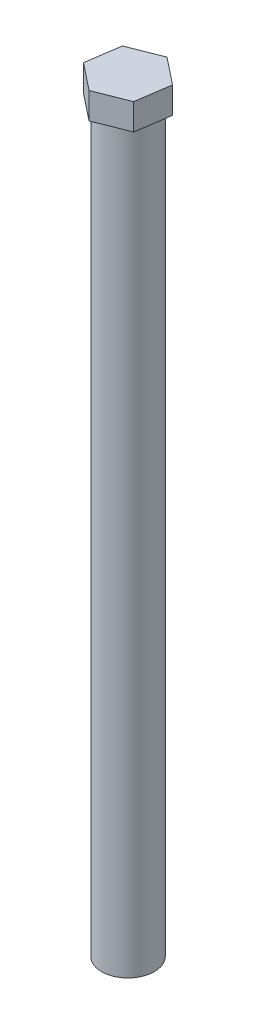
ISO-10303-21;
HEADER;
FILE_DESCRIPTION(('STEP AP214'),'2;1');
FILE_NAME('part.step','',(''),(''),'','','');
FILE_SCHEMA(('AUTOMOTIVE_DESIGN { 1 0 10303 214 1 1 1 1 }'));
ENDSEC;
DATA;
#1=APPLICATION_CONTEXT('core data for automotive mechanical design processes');
#2=APPLICATION_PROTOCOL_DEFINITION('international standard','automotive_design',2000,#1);
#3=PRODUCT_CONTEXT('',#1,'mechanical');
#4=PRODUCT('Part','Part','',(#3));
#5=PRODUCT_RELATED_PRODUCT_CATEGORY('part','',(#4));
#6=PRODUCT_DEFINITION_FORMATION('','',#4);
#7=PRODUCT_DEFINITION_CONTEXT('part definition',#1,'design');
#8=PRODUCT_DEFINITION('design','',#6,#7);
#9=PRODUCT_DEFINITION_SHAPE('','',#8);
#10=(LENGTH_UNIT() NAMED_UNIT(*) SI_UNIT(.MILLI.,.METRE.));
#11=(NAMED_UNIT(*) PLANE_ANGLE_UNIT() SI_UNIT($,.RADIAN.));
#12=(NAMED_UNIT(*) SI_UNIT($,.STERADIAN.) SOLID_ANGLE_UNIT());
#13=UNCERTAINTY_MEASURE_WITH_UNIT(LENGTH_MEASURE(1.E-05),#10,'distance_accuracy_value','');
#14=(GEOMETRIC_REPRESENTATION_CONTEXT(3) GLOBAL_UNCERTAINTY_ASSIGNED_CONTEXT((#13)) GLOBAL_UNIT_ASSIGNED_CONTEXT((#10,
#11,#12)) REPRESENTATION_CONTEXT('',''));
#15=CARTESIAN_POINT('',(0.,0.,0.));
#16=DIRECTION('',(0.,0.,1.));
#17=DIRECTION('',(1.,0.,0.));
#18=AXIS2_PLACEMENT_3D('',#15,#16,#17);
#19=CARTESIAN_POINT('',(0.,56.,0.));
#20=DIRECTION('',(0.,-1.,0.));
#21=DIRECTION('',(0.,0.,-1.));
#22=AXIS2_PLACEMENT_3D('',#19,#20,#21);
#23=CYLINDRICAL_SURFACE('',#22,2.);
#24=CARTESIAN_POINT('',(0.,56.,0.));
#25=DIRECTION('',(0.,1.,0.));
#26=DIRECTION('',(0.,0.,1.));
#27=AXIS2_PLACEMENT_3D('',#24,#25,#26);
#28=CIRCLE('',#27,2.);
#29=CARTESIAN_POINT('',(0.,56.,2.));
#30=VERTEX_POINT('',#29);
#31=EDGE_CURVE('E11',#30,#30,#28,.T.);
#32=ORIENTED_EDGE('',*,*,#31,.F.);
#33=EDGE_LOOP('',(#32));
#34=FACE_BOUND('',#33,.T.);
#35=CARTESIAN_POINT('',(0.,0.,0.));
#36=DIRECTION('',(0.,1.,0.));
#37=DIRECTION('',(0.,0.,1.));
#38=AXIS2_PLACEMENT_3D('',#35,#36,#37);
#39=CIRCLE('',#38,2.);
#40=CARTESIAN_POINT('',(0.,0.,2.));
#41=VERTEX_POINT('',#40);
#42=EDGE_CURVE('E41',#41,#41,#39,.T.);
#43=ORIENTED_EDGE('',*,*,#42,.T.);
#44=EDGE_LOOP('',(#43));
#45=FACE_BOUND('',#44,.T.);
#46=ADVANCED_FACE('F38',(#34,#45),#23,.T.);
#47=CARTESIAN_POINT('',(0.,0.,0.));
#48=DIRECTION('',(0.,1.,0.));
#49=DIRECTION('',(0.,0.,1.));
#50=AXIS2_PLACEMENT_3D('',#47,#48,#49);
#51=PLANE('',#50);
#52=ORIENTED_EDGE('',*,*,#42,.F.);
#53=EDGE_LOOP('',(#52));
#54=FACE_BOUND('',#53,.T.);
#55=ADVANCED_FACE('F146',(#54),#51,.F.);
#56=CARTESIAN_POINT('',(-0.379215264473462,58.,2.57451992844357));
#57=DIRECTION('',(-0.368462703379493,0.,-0.929642531416391));
#58=DIRECTION('',(-0.929642531416391,0.,0.368462703379493));
#59=AXIS2_PLACEMENT_3D('',#56,#57,#58);
#60=PLANE('',#59);
#61=DIRECTION('',(0.929642531416391,0.,-0.368462703379493));
#62=VECTOR('',#61,1.);
#63=CARTESIAN_POINT('',(-0.379215264473462,56.,2.57451992844357));
#64=LINE('',#63,#62);
#65=CARTESIAN_POINT('',(-0.379215264473462,56.,2.57451992844357));
#66=VERTEX_POINT('',#65);
#67=CARTESIAN_POINT('',(2.0399920283447,56.,1.61567001675864));
#68=VERTEX_POINT('',#67);
#69=EDGE_CURVE('E123',#66,#68,#64,.T.);
#70=ORIENTED_EDGE('',*,*,#69,.T.);
#71=DIRECTION('',(0.,-1.,0.));
#72=VECTOR('',#71,1.);
#73=CARTESIAN_POINT('',(2.0399920283447,58.,1.61567001675864));
#74=LINE('',#73,#72);
#75=CARTESIAN_POINT('',(2.0399920283447,58.,1.61567001675864));
#76=VERTEX_POINT('',#75);
#77=EDGE_CURVE('E140',#76,#68,#74,.T.);
#78=ORIENTED_EDGE('',*,*,#77,.F.);
#79=DIRECTION('',(0.929642531416391,0.,-0.368462703379493));
#80=VECTOR('',#79,1.);
#81=CARTESIAN_POINT('',(-0.379215264473462,58.,2.57451992844357));
#82=LINE('',#81,#80);
#83=CARTESIAN_POINT('',(-0.379215264473462,58.,2.57451992844357));
#84=VERTEX_POINT('',#83);
#85=EDGE_CURVE('E133',#84,#76,#82,.T.);
#86=ORIENTED_EDGE('',*,*,#85,.F.);
#87=DIRECTION('',(0.,-1.,0.));
#88=VECTOR('',#87,1.);
#89=CARTESIAN_POINT('',(-0.379215264473462,58.,2.57451992844357));
#90=LINE('',#89,#88);
#91=EDGE_CURVE('E119',#84,#66,#90,.T.);
#92=ORIENTED_EDGE('',*,*,#91,.T.);
#93=EDGE_LOOP('',(#70,#78,#86,#92));
#94=FACE_BOUND('',#93,.T.);
#95=ADVANCED_FACE('F148',(#94),#60,.F.);
#96=CARTESIAN_POINT('',(2.0399920283447,58.,1.61567001675864));
#97=DIRECTION('',(-0.989325400334814,0.,-0.145723204234464));
#98=DIRECTION('',(-0.145723204234464,0.,0.989325400334814));
#99=AXIS2_PLACEMENT_3D('',#96,#97,#98);
#100=PLANE('',#99);
#101=DIRECTION('',(0.145723204234464,0.,-0.989325400334814));
#102=VECTOR('',#101,1.);
#103=CARTESIAN_POINT('',(2.0399920283447,56.,1.61567001675864));
#104=LINE('',#103,#102);
#105=CARTESIAN_POINT('',(2.41920729281816,56.,-0.958849911684933));
#106=VERTEX_POINT('',#105);
#107=EDGE_CURVE('E126',#68,#106,#104,.T.);
#108=ORIENTED_EDGE('',*,*,#107,.T.);
#109=DIRECTION('',(0.,-1.,0.));
#110=VECTOR('',#109,1.);
#111=CARTESIAN_POINT('',(2.41920729281816,58.,-0.958849911684933));
#112=LINE('',#111,#110);
#113=CARTESIAN_POINT('',(2.41920729281816,58.,-0.958849911684933));
#114=VERTEX_POINT('',#113);
#115=EDGE_CURVE('E137',#114,#106,#112,.T.);
#116=ORIENTED_EDGE('',*,*,#115,.F.);
#117=DIRECTION('',(0.145723204234464,0.,-0.989325400334814));
#118=VECTOR('',#117,1.);
#119=CARTESIAN_POINT('',(2.0399920283447,58.,1.61567001675864));
#120=LINE('',#119,#118);
#121=EDGE_CURVE('E92',#76,#114,#120,.T.);
#122=ORIENTED_EDGE('',*,*,#121,.F.);
#123=ORIENTED_EDGE('',*,*,#77,.T.);
#124=EDGE_LOOP('',(#108,#116,#122,#123));
#125=FACE_BOUND('',#124,.T.);
#126=ADVANCED_FACE('F153',(#125),#100,.F.);
#127=CARTESIAN_POINT('',(2.41920729281816,58.,-0.958849911684933));
#128=DIRECTION('',(-0.620862696955321,0.,0.783919327181927));
#129=DIRECTION('',(0.783919327181927,0.,0.620862696955321));
#130=AXIS2_PLACEMENT_3D('',#127,#128,#129);
#131=PLANE('',#130);
#132=DIRECTION('',(-0.783919327181927,0.,-0.620862696955321));
#133=VECTOR('',#132,1.);
#134=CARTESIAN_POINT('',(2.41920729281816,56.,-0.958849911684933));
#135=LINE('',#134,#133);
#136=CARTESIAN_POINT('',(0.379215264473462,56.,-2.57451992844357));
#137=VERTEX_POINT('',#136);
#138=EDGE_CURVE('E128',#106,#137,#135,.T.);
#139=ORIENTED_EDGE('',*,*,#138,.T.);
#140=DIRECTION('',(0.,-1.,0.));
#141=VECTOR('',#140,1.);
#142=CARTESIAN_POINT('',(0.379215264473462,58.,-2.57451992844357));
#143=LINE('',#142,#141);
#144=CARTESIAN_POINT('',(0.379215264473462,58.,-2.57451992844357));
#145=VERTEX_POINT('',#144);
#146=EDGE_CURVE('E114',#145,#137,#143,.T.);
#147=ORIENTED_EDGE('',*,*,#146,.F.);
#148=DIRECTION('',(-0.783919327181927,0.,-0.620862696955321));
#149=VECTOR('',#148,1.);
#150=CARTESIAN_POINT('',(2.41920729281816,58.,-0.958849911684933));
#151=LINE('',#150,#149);
#152=EDGE_CURVE('E105',#114,#145,#151,.T.);
#153=ORIENTED_EDGE('',*,*,#152,.F.);
#154=ORIENTED_EDGE('',*,*,#115,.T.);
#155=EDGE_LOOP('',(#139,#147,#153,#154));
#156=FACE_BOUND('',#155,.T.);
#157=ADVANCED_FACE('F160',(#156),#131,.F.);
#158=CARTESIAN_POINT('',(0.379215264473462,58.,-2.57451992844357));
#159=DIRECTION('',(0.368462703379493,0.,0.929642531416391));
#160=DIRECTION('',(0.929642531416391,0.,-0.368462703379493));
#161=AXIS2_PLACEMENT_3D('',#158,#159,#160);
#162=PLANE('',#161);
#163=DIRECTION('',(-0.929642531416391,0.,0.368462703379493));
#164=VECTOR('',#163,1.);
#165=CARTESIAN_POINT('',(0.379215264473462,56.,-2.57451992844357));
#166=LINE('',#165,#164);
#167=CARTESIAN_POINT('',(-2.0399920283447,56.,-1.61567001675864));
#168=VERTEX_POINT('',#167);
#169=EDGE_CURVE('E113',#137,#168,#166,.T.);
#170=ORIENTED_EDGE('',*,*,#169,.T.);
#171=DIRECTION('',(0.,-1.,0.));
#172=VECTOR('',#171,1.);
#173=CARTESIAN_POINT('',(-2.0399920283447,58.,-1.61567001675864));
#174=LINE('',#173,#172);
#175=CARTESIAN_POINT('',(-2.0399920283447,58.,-1.61567001675864));
#176=VERTEX_POINT('',#175);
#177=EDGE_CURVE('E110',#176,#168,#174,.T.);
#178=ORIENTED_EDGE('',*,*,#177,.F.);
#179=DIRECTION('',(-0.929642531416391,0.,0.368462703379493));
#180=VECTOR('',#179,1.);
#181=CARTESIAN_POINT('',(0.379215264473462,58.,-2.57451992844357));
#182=LINE('',#181,#180);
#183=EDGE_CURVE('E99',#145,#176,#182,.T.);
#184=ORIENTED_EDGE('',*,*,#183,.F.);
#185=ORIENTED_EDGE('',*,*,#146,.T.);
#186=EDGE_LOOP('',(#170,#178,#184,#185));
#187=FACE_BOUND('',#186,.T.);
#188=ADVANCED_FACE('F111',(#187),#162,.F.);
#189=CARTESIAN_POINT('',(-2.0399920283447,58.,-1.61567001675864));
#190=DIRECTION('',(0.989325400334814,0.,0.145723204234464));
#191=DIRECTION('',(0.145723204234464,0.,-0.989325400334814));
#192=AXIS2_PLACEMENT_3D('',#189,#190,#191);
#193=PLANE('',#192);
#194=DIRECTION('',(-0.145723204234464,0.,0.989325400334814));
#195=VECTOR('',#194,1.);
#196=CARTESIAN_POINT('',(-2.0399920283447,56.,-1.61567001675864));
#197=LINE('',#196,#195);
#198=CARTESIAN_POINT('',(-2.41920729281816,56.,0.958849911684932));
#199=VERTEX_POINT('',#198);
#200=EDGE_CURVE('E77',#168,#199,#197,.T.);
#201=ORIENTED_EDGE('',*,*,#200,.T.);
#202=DIRECTION('',(0.,-1.,0.));
#203=VECTOR('',#202,1.);
#204=CARTESIAN_POINT('',(-2.41920729281816,58.,0.958849911684932));
#205=LINE('',#204,#203);
#206=CARTESIAN_POINT('',(-2.41920729281816,58.,0.958849911684932));
#207=VERTEX_POINT('',#206);
#208=EDGE_CURVE('E115',#207,#199,#205,.T.);
#209=ORIENTED_EDGE('',*,*,#208,.F.);
#210=DIRECTION('',(-0.145723204234464,0.,0.989325400334814));
#211=VECTOR('',#210,1.);
#212=CARTESIAN_POINT('',(-2.0399920283447,58.,-1.61567001675864));
#213=LINE('',#212,#211);
#214=EDGE_CURVE('E103',#176,#207,#213,.T.);
#215=ORIENTED_EDGE('',*,*,#214,.F.);
#216=ORIENTED_EDGE('',*,*,#177,.T.);
#217=EDGE_LOOP('',(#201,#209,#215,#216));
#218=FACE_BOUND('',#217,.T.);
#219=ADVANCED_FACE('F117',(#218),#193,.F.);
#220=CARTESIAN_POINT('',(-2.41920729281816,58.,0.958849911684932));
#221=DIRECTION('',(0.620862696955321,0.,-0.783919327181927));
#222=DIRECTION('',(-0.783919327181927,0.,-0.620862696955321));
#223=AXIS2_PLACEMENT_3D('',#220,#221,#222);
#224=PLANE('',#223);
#225=DIRECTION('',(0.783919327181927,0.,0.620862696955321));
#226=VECTOR('',#225,1.);
#227=CARTESIAN_POINT('',(-2.41920729281816,56.,0.958849911684932));
#228=LINE('',#227,#226);
#229=EDGE_CURVE('E83',#199,#66,#228,.T.);
#230=ORIENTED_EDGE('',*,*,#229,.T.);
#231=ORIENTED_EDGE('',*,*,#91,.F.);
#232=DIRECTION('',(0.783919327181927,0.,0.620862696955321));
#233=VECTOR('',#232,1.);
#234=CARTESIAN_POINT('',(-2.41920729281816,58.,0.958849911684932));
#235=LINE('',#234,#233);
#236=EDGE_CURVE('E54',#207,#84,#235,.T.);
#237=ORIENTED_EDGE('',*,*,#236,.F.);
#238=ORIENTED_EDGE('',*,*,#208,.T.);
#239=EDGE_LOOP('',(#230,#231,#237,#238));
#240=FACE_BOUND('',#239,.T.);
#241=ADVANCED_FACE('F168',(#240),#224,.F.);
#242=CARTESIAN_POINT('',(0.,58.,0.));
#243=DIRECTION('',(0.,1.,0.));
#244=DIRECTION('',(0.,0.,1.));
#245=AXIS2_PLACEMENT_3D('',#242,#243,#244);
#246=PLANE('',#245);
#247=ORIENTED_EDGE('',*,*,#85,.T.);
#248=ORIENTED_EDGE('',*,*,#121,.T.);
#249=ORIENTED_EDGE('',*,*,#152,.T.);
#250=ORIENTED_EDGE('',*,*,#183,.T.);
#251=ORIENTED_EDGE('',*,*,#214,.T.);
#252=ORIENTED_EDGE('',*,*,#236,.T.);
#253=EDGE_LOOP('',(#247,#248,#249,#250,#251,#252));
#254=FACE_BOUND('',#253,.T.);
#255=ADVANCED_FACE('F101',(#254),#246,.T.);
#256=CARTESIAN_POINT('',(0.,56.,0.));
#257=DIRECTION('',(0.,1.,0.));
#258=DIRECTION('',(0.,0.,1.));
#259=AXIS2_PLACEMENT_3D('',#256,#257,#258);
#260=PLANE('',#259);
#261=ORIENTED_EDGE('',*,*,#31,.T.);
#262=EDGE_LOOP('',(#261));
#263=FACE_BOUND('',#262,.T.);
#264=ORIENTED_EDGE('',*,*,#69,.F.);
#265=ORIENTED_EDGE('',*,*,#229,.F.);
#266=ORIENTED_EDGE('',*,*,#200,.F.);
#267=ORIENTED_EDGE('',*,*,#169,.F.);
#268=ORIENTED_EDGE('',*,*,#138,.F.);
#269=ORIENTED_EDGE('',*,*,#107,.F.);
#270=EDGE_LOOP('',(#264,#265,#266,#267,#268,#269));
#271=FACE_BOUND('',#270,.T.);
#272=ADVANCED_FACE('F171',(#263,#271),#260,.F.);
#273=CLOSED_SHELL('',(#46,#55,#95,#126,#157,#188,#219,#241,#255,#272));
#274=MANIFOLD_SOLID_BREP('B2',#273);
#275=ADVANCED_BREP_SHAPE_REPRESENTATION('',(#18,#274),#14);
#276=SHAPE_DEFINITION_REPRESENTATION(#9,#275);
ENDSEC;
END-ISO-10303-21;
